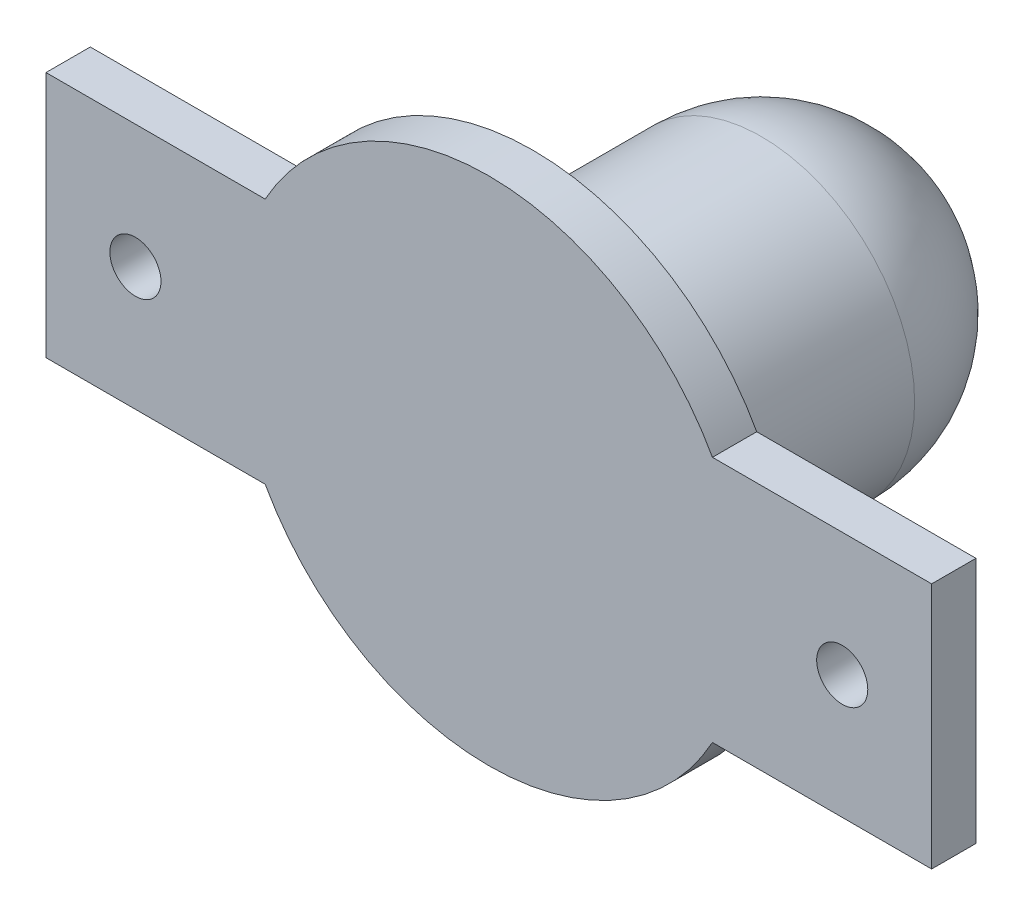
ISO-10303-21;
HEADER;
FILE_DESCRIPTION(('STEP AP214'),'2;1');
FILE_NAME('part.step','',(''),(''),'','','');
FILE_SCHEMA(('AUTOMOTIVE_DESIGN { 1 0 10303 214 1 1 1 1 }'));
ENDSEC;
DATA;
#1=APPLICATION_CONTEXT('core data for automotive mechanical design processes');
#2=APPLICATION_PROTOCOL_DEFINITION('international standard','automotive_design',2000,#1);
#3=PRODUCT_CONTEXT('',#1,'mechanical');
#4=PRODUCT('Part','Part','',(#3));
#5=PRODUCT_RELATED_PRODUCT_CATEGORY('part','',(#4));
#6=PRODUCT_DEFINITION_FORMATION('','',#4);
#7=PRODUCT_DEFINITION_CONTEXT('part definition',#1,'design');
#8=PRODUCT_DEFINITION('design','',#6,#7);
#9=PRODUCT_DEFINITION_SHAPE('','',#8);
#10=(LENGTH_UNIT() NAMED_UNIT(*) SI_UNIT(.MILLI.,.METRE.));
#11=(NAMED_UNIT(*) PLANE_ANGLE_UNIT() SI_UNIT($,.RADIAN.));
#12=(NAMED_UNIT(*) SI_UNIT($,.STERADIAN.) SOLID_ANGLE_UNIT());
#13=UNCERTAINTY_MEASURE_WITH_UNIT(LENGTH_MEASURE(1.E-05),#10,'distance_accuracy_value','');
#14=(GEOMETRIC_REPRESENTATION_CONTEXT(3) GLOBAL_UNCERTAINTY_ASSIGNED_CONTEXT((#13)) GLOBAL_UNIT_ASSIGNED_CONTEXT((#10,
#11,#12)) REPRESENTATION_CONTEXT('',''));
#15=CARTESIAN_POINT('',(0.,0.,0.));
#16=DIRECTION('',(0.,0.,1.));
#17=DIRECTION('',(1.,0.,0.));
#18=AXIS2_PLACEMENT_3D('',#15,#16,#17);
#19=CARTESIAN_POINT('',(26.,-7.25000000000001,-2.6));
#20=DIRECTION('',(0.,-1.,0.));
#21=DIRECTION('',(0.,0.,-1.));
#22=AXIS2_PLACEMENT_3D('',#19,#20,#21);
#23=PLANE('',#22);
#24=DIRECTION('',(1.,0.,0.));
#25=VECTOR('',#24,1.);
#26=CARTESIAN_POINT('',(26.,-7.25000000000001,0.));
#27=LINE('',#26,#25);
#28=CARTESIAN_POINT('',(13.13,-7.25000000000002,0.));
#29=VERTEX_POINT('',#28);
#30=CARTESIAN_POINT('',(26.,-7.25000000000001,0.));
#31=VERTEX_POINT('',#30);
#32=EDGE_CURVE('E133',#29,#31,#27,.T.);
#33=ORIENTED_EDGE('',*,*,#32,.F.);
#34=DIRECTION('',(0.,0.,1.));
#35=VECTOR('',#34,1.);
#36=CARTESIAN_POINT('',(13.13,-7.25000000000002,-2.6));
#37=LINE('',#36,#35);
#38=CARTESIAN_POINT('',(13.13,-7.25000000000002,-2.6));
#39=VERTEX_POINT('',#38);
#40=EDGE_CURVE('E11',#39,#29,#37,.T.);
#41=ORIENTED_EDGE('',*,*,#40,.F.);
#42=DIRECTION('',(1.,0.,0.));
#43=VECTOR('',#42,1.);
#44=CARTESIAN_POINT('',(26.,-7.25000000000001,-2.6));
#45=LINE('',#44,#43);
#46=CARTESIAN_POINT('',(26.,-7.25000000000001,-2.6));
#47=VERTEX_POINT('',#46);
#48=EDGE_CURVE('E154',#39,#47,#45,.T.);
#49=ORIENTED_EDGE('',*,*,#48,.T.);
#50=DIRECTION('',(0.,0.,1.));
#51=VECTOR('',#50,1.);
#52=CARTESIAN_POINT('',(26.,-7.25000000000001,-2.6));
#53=LINE('',#52,#51);
#54=EDGE_CURVE('E39',#47,#31,#53,.T.);
#55=ORIENTED_EDGE('',*,*,#54,.T.);
#56=EDGE_LOOP('',(#33,#41,#49,#55));
#57=FACE_BOUND('',#56,.T.);
#58=ADVANCED_FACE('F36',(#57),#23,.T.);
#59=CARTESIAN_POINT('',(0.,0.,-2.6));
#60=DIRECTION('',(0.,0.,1.));
#61=DIRECTION('',(1.,0.,0.));
#62=AXIS2_PLACEMENT_3D('',#59,#60,#61);
#63=CYLINDRICAL_SURFACE('',#62,14.9986466056108);
#64=CARTESIAN_POINT('',(0.,0.,0.));
#65=DIRECTION('',(0.,0.,1.));
#66=DIRECTION('',(1.,0.,0.));
#67=AXIS2_PLACEMENT_3D('',#64,#65,#66);
#68=CIRCLE('',#67,14.9986466056108);
#69=CARTESIAN_POINT('',(-13.13,-7.25,0.));
#70=VERTEX_POINT('',#69);
#71=EDGE_CURVE('E152',#70,#29,#68,.T.);
#72=ORIENTED_EDGE('',*,*,#71,.F.);
#73=DIRECTION('',(0.,0.,1.));
#74=VECTOR('',#73,1.);
#75=CARTESIAN_POINT('',(-13.13,-7.25,-2.6));
#76=LINE('',#75,#74);
#77=CARTESIAN_POINT('',(-13.13,-7.25,-2.6));
#78=VERTEX_POINT('',#77);
#79=EDGE_CURVE('E45',#78,#70,#76,.T.);
#80=ORIENTED_EDGE('',*,*,#79,.F.);
#81=CARTESIAN_POINT('',(0.,0.,-2.6));
#82=DIRECTION('',(0.,0.,1.));
#83=DIRECTION('',(1.,0.,0.));
#84=AXIS2_PLACEMENT_3D('',#81,#82,#83);
#85=CIRCLE('',#84,14.9986466056108);
#86=EDGE_CURVE('E123',#78,#39,#85,.T.);
#87=ORIENTED_EDGE('',*,*,#86,.T.);
#88=ORIENTED_EDGE('',*,*,#40,.T.);
#89=EDGE_LOOP('',(#72,#80,#87,#88));
#90=FACE_BOUND('',#89,.T.);
#91=ADVANCED_FACE('F166',(#90),#63,.T.);
#92=CARTESIAN_POINT('',(-26.,-7.25,-2.6));
#93=DIRECTION('',(0.,-1.,0.));
#94=DIRECTION('',(0.,0.,-1.));
#95=AXIS2_PLACEMENT_3D('',#92,#93,#94);
#96=PLANE('',#95);
#97=DIRECTION('',(1.,0.,0.));
#98=VECTOR('',#97,1.);
#99=CARTESIAN_POINT('',(-26.,-7.25,0.));
#100=LINE('',#99,#98);
#101=CARTESIAN_POINT('',(-26.,-7.25,0.));
#102=VERTEX_POINT('',#101);
#103=EDGE_CURVE('E110',#102,#70,#100,.T.);
#104=ORIENTED_EDGE('',*,*,#103,.F.);
#105=DIRECTION('',(0.,0.,1.));
#106=VECTOR('',#105,1.);
#107=CARTESIAN_POINT('',(-26.,-7.25,-2.6));
#108=LINE('',#107,#106);
#109=CARTESIAN_POINT('',(-26.,-7.25,-2.6));
#110=VERTEX_POINT('',#109);
#111=EDGE_CURVE('E105',#110,#102,#108,.T.);
#112=ORIENTED_EDGE('',*,*,#111,.F.);
#113=DIRECTION('',(1.,0.,0.));
#114=VECTOR('',#113,1.);
#115=CARTESIAN_POINT('',(-26.,-7.25,-2.6));
#116=LINE('',#115,#114);
#117=EDGE_CURVE('E108',#110,#78,#116,.T.);
#118=ORIENTED_EDGE('',*,*,#117,.T.);
#119=ORIENTED_EDGE('',*,*,#79,.T.);
#120=EDGE_LOOP('',(#104,#112,#118,#119));
#121=FACE_BOUND('',#120,.T.);
#122=ADVANCED_FACE('F107',(#121),#96,.T.);
#123=CARTESIAN_POINT('',(-26.,-7.25,-2.6));
#124=DIRECTION('',(-1.,0.,0.));
#125=DIRECTION('',(0.,0.,1.));
#126=AXIS2_PLACEMENT_3D('',#123,#124,#125);
#127=PLANE('',#126);
#128=DIRECTION('',(0.,-1.,0.));
#129=VECTOR('',#128,1.);
#130=CARTESIAN_POINT('',(-26.,-7.25,0.));
#131=LINE('',#130,#129);
#132=CARTESIAN_POINT('',(-26.,7.25,0.));
#133=VERTEX_POINT('',#132);
#134=EDGE_CURVE('E149',#133,#102,#131,.T.);
#135=ORIENTED_EDGE('',*,*,#134,.F.);
#136=DIRECTION('',(0.,0.,1.));
#137=VECTOR('',#136,1.);
#138=CARTESIAN_POINT('',(-26.,7.25,-2.6));
#139=LINE('',#138,#137);
#140=CARTESIAN_POINT('',(-26.,7.25,-2.6));
#141=VERTEX_POINT('',#140);
#142=EDGE_CURVE('E115',#141,#133,#139,.T.);
#143=ORIENTED_EDGE('',*,*,#142,.F.);
#144=DIRECTION('',(0.,-1.,0.));
#145=VECTOR('',#144,1.);
#146=CARTESIAN_POINT('',(-26.,-7.25,-2.6));
#147=LINE('',#146,#145);
#148=EDGE_CURVE('E121',#141,#110,#147,.T.);
#149=ORIENTED_EDGE('',*,*,#148,.T.);
#150=ORIENTED_EDGE('',*,*,#111,.T.);
#151=EDGE_LOOP('',(#135,#143,#149,#150));
#152=FACE_BOUND('',#151,.T.);
#153=ADVANCED_FACE('F125',(#152),#127,.T.);
#154=CARTESIAN_POINT('',(-26.,7.25,-2.6));
#155=DIRECTION('',(0.,1.,0.));
#156=DIRECTION('',(0.,0.,1.));
#157=AXIS2_PLACEMENT_3D('',#154,#155,#156);
#158=PLANE('',#157);
#159=DIRECTION('',(-1.,0.,0.));
#160=VECTOR('',#159,1.);
#161=CARTESIAN_POINT('',(-26.,7.25,0.));
#162=LINE('',#161,#160);
#163=CARTESIAN_POINT('',(-13.13,7.25,0.));
#164=VERTEX_POINT('',#163);
#165=EDGE_CURVE('E146',#164,#133,#162,.T.);
#166=ORIENTED_EDGE('',*,*,#165,.F.);
#167=DIRECTION('',(0.,0.,1.));
#168=VECTOR('',#167,1.);
#169=CARTESIAN_POINT('',(-13.13,7.25,-2.6));
#170=LINE('',#169,#168);
#171=CARTESIAN_POINT('',(-13.13,7.25,-2.6));
#172=VERTEX_POINT('',#171);
#173=EDGE_CURVE('E158',#172,#164,#170,.T.);
#174=ORIENTED_EDGE('',*,*,#173,.F.);
#175=DIRECTION('',(-1.,0.,0.));
#176=VECTOR('',#175,1.);
#177=CARTESIAN_POINT('',(-26.,7.25,-2.6));
#178=LINE('',#177,#176);
#179=EDGE_CURVE('E126',#172,#141,#178,.T.);
#180=ORIENTED_EDGE('',*,*,#179,.T.);
#181=ORIENTED_EDGE('',*,*,#142,.T.);
#182=EDGE_LOOP('',(#166,#174,#180,#181));
#183=FACE_BOUND('',#182,.T.);
#184=ADVANCED_FACE('F179',(#183),#158,.T.);
#185=CARTESIAN_POINT('',(0.,0.,-2.6));
#186=DIRECTION('',(0.,0.,1.));
#187=DIRECTION('',(1.,0.,0.));
#188=AXIS2_PLACEMENT_3D('',#185,#186,#187);
#189=CYLINDRICAL_SURFACE('',#188,14.9986466056108);
#190=CARTESIAN_POINT('',(0.,0.,0.));
#191=DIRECTION('',(0.,0.,1.));
#192=DIRECTION('',(-1.,0.,0.));
#193=AXIS2_PLACEMENT_3D('',#190,#191,#192);
#194=CIRCLE('',#193,14.9986466056108);
#195=CARTESIAN_POINT('',(13.13,7.25000000000001,0.));
#196=VERTEX_POINT('',#195);
#197=EDGE_CURVE('E143',#196,#164,#194,.T.);
#198=ORIENTED_EDGE('',*,*,#197,.F.);
#199=DIRECTION('',(0.,0.,1.));
#200=VECTOR('',#199,1.);
#201=CARTESIAN_POINT('',(13.13,7.25000000000001,-2.6));
#202=LINE('',#201,#200);
#203=CARTESIAN_POINT('',(13.13,7.25000000000001,-2.6));
#204=VERTEX_POINT('',#203);
#205=EDGE_CURVE('E160',#204,#196,#202,.T.);
#206=ORIENTED_EDGE('',*,*,#205,.F.);
#207=CARTESIAN_POINT('',(0.,0.,-2.6));
#208=DIRECTION('',(0.,0.,1.));
#209=DIRECTION('',(-1.,0.,0.));
#210=AXIS2_PLACEMENT_3D('',#207,#208,#209);
#211=CIRCLE('',#210,14.9986466056108);
#212=EDGE_CURVE('E128',#204,#172,#211,.T.);
#213=ORIENTED_EDGE('',*,*,#212,.T.);
#214=ORIENTED_EDGE('',*,*,#173,.T.);
#215=EDGE_LOOP('',(#198,#206,#213,#214));
#216=FACE_BOUND('',#215,.T.);
#217=ADVANCED_FACE('F182',(#216),#189,.T.);
#218=CARTESIAN_POINT('',(26.,7.25000000000001,-2.6));
#219=DIRECTION('',(0.,1.,0.));
#220=DIRECTION('',(0.,0.,1.));
#221=AXIS2_PLACEMENT_3D('',#218,#219,#220);
#222=PLANE('',#221);
#223=DIRECTION('',(-1.,0.,0.));
#224=VECTOR('',#223,1.);
#225=CARTESIAN_POINT('',(26.,7.25000000000001,0.));
#226=LINE('',#225,#224);
#227=CARTESIAN_POINT('',(26.,7.25000000000001,0.));
#228=VERTEX_POINT('',#227);
#229=EDGE_CURVE('E140',#228,#196,#226,.T.);
#230=ORIENTED_EDGE('',*,*,#229,.F.);
#231=DIRECTION('',(0.,0.,1.));
#232=VECTOR('',#231,1.);
#233=CARTESIAN_POINT('',(26.,7.25000000000001,-2.6));
#234=LINE('',#233,#232);
#235=CARTESIAN_POINT('',(26.,7.25000000000001,-2.6));
#236=VERTEX_POINT('',#235);
#237=EDGE_CURVE('E161',#236,#228,#234,.T.);
#238=ORIENTED_EDGE('',*,*,#237,.F.);
#239=DIRECTION('',(-1.,0.,0.));
#240=VECTOR('',#239,1.);
#241=CARTESIAN_POINT('',(26.,7.25000000000001,-2.6));
#242=LINE('',#241,#240);
#243=EDGE_CURVE('E239',#236,#204,#242,.T.);
#244=ORIENTED_EDGE('',*,*,#243,.T.);
#245=ORIENTED_EDGE('',*,*,#205,.T.);
#246=EDGE_LOOP('',(#230,#238,#244,#245));
#247=FACE_BOUND('',#246,.T.);
#248=ADVANCED_FACE('F186',(#247),#222,.T.);
#249=CARTESIAN_POINT('',(26.,-7.25000000000001,-2.6));
#250=DIRECTION('',(1.,0.,0.));
#251=DIRECTION('',(0.,0.,-1.));
#252=AXIS2_PLACEMENT_3D('',#249,#250,#251);
#253=PLANE('',#252);
#254=DIRECTION('',(0.,1.,0.));
#255=VECTOR('',#254,1.);
#256=CARTESIAN_POINT('',(26.,-7.25000000000001,0.));
#257=LINE('',#256,#255);
#258=EDGE_CURVE('E136',#31,#228,#257,.T.);
#259=ORIENTED_EDGE('',*,*,#258,.F.);
#260=ORIENTED_EDGE('',*,*,#54,.F.);
#261=DIRECTION('',(0.,1.,0.));
#262=VECTOR('',#261,1.);
#263=CARTESIAN_POINT('',(26.,-7.25000000000001,-2.6));
#264=LINE('',#263,#262);
#265=EDGE_CURVE('E237',#47,#236,#264,.T.);
#266=ORIENTED_EDGE('',*,*,#265,.T.);
#267=ORIENTED_EDGE('',*,*,#237,.T.);
#268=EDGE_LOOP('',(#259,#260,#266,#267));
#269=FACE_BOUND('',#268,.T.);
#270=ADVANCED_FACE('F163',(#269),#253,.T.);
#271=CARTESIAN_POINT('',(0.,0.,-2.6));
#272=DIRECTION('',(0.,0.,1.));
#273=DIRECTION('',(1.,0.,0.));
#274=AXIS2_PLACEMENT_3D('',#271,#272,#273);
#275=PLANE('',#274);
#276=CARTESIAN_POINT('',(-20.75,0.,-2.6));
#277=DIRECTION('',(0.,0.,1.));
#278=DIRECTION('',(1.,0.,0.));
#279=AXIS2_PLACEMENT_3D('',#276,#277,#278);
#280=CIRCLE('',#279,1.5);
#281=CARTESIAN_POINT('',(-19.25,0.,-2.6));
#282=VERTEX_POINT('',#281);
#283=EDGE_CURVE('E224',#282,#282,#280,.T.);
#284=ORIENTED_EDGE('',*,*,#283,.T.);
#285=EDGE_LOOP('',(#284));
#286=FACE_BOUND('',#285,.T.);
#287=CARTESIAN_POINT('',(20.75,0.,-2.6));
#288=DIRECTION('',(0.,0.,1.));
#289=DIRECTION('',(1.,0.,0.));
#290=AXIS2_PLACEMENT_3D('',#287,#288,#289);
#291=CIRCLE('',#290,1.5);
#292=CARTESIAN_POINT('',(22.25,0.,-2.6));
#293=VERTEX_POINT('',#292);
#294=EDGE_CURVE('E226',#293,#293,#291,.T.);
#295=ORIENTED_EDGE('',*,*,#294,.T.);
#296=EDGE_LOOP('',(#295));
#297=FACE_BOUND('',#296,.T.);
#298=CARTESIAN_POINT('',(0.,0.,-2.6));
#299=DIRECTION('',(0.,0.,1.));
#300=DIRECTION('',(1.,0.,0.));
#301=AXIS2_PLACEMENT_3D('',#298,#299,#300);
#302=CIRCLE('',#301,9.);
#303=CARTESIAN_POINT('',(9.,0.,-2.6));
#304=VERTEX_POINT('',#303);
#305=EDGE_CURVE('E137',#304,#304,#302,.T.);
#306=ORIENTED_EDGE('',*,*,#305,.T.);
#307=EDGE_LOOP('',(#306));
#308=FACE_BOUND('',#307,.T.);
#309=ORIENTED_EDGE('',*,*,#48,.F.);
#310=ORIENTED_EDGE('',*,*,#86,.F.);
#311=ORIENTED_EDGE('',*,*,#117,.F.);
#312=ORIENTED_EDGE('',*,*,#148,.F.);
#313=ORIENTED_EDGE('',*,*,#179,.F.);
#314=ORIENTED_EDGE('',*,*,#212,.F.);
#315=ORIENTED_EDGE('',*,*,#243,.F.);
#316=ORIENTED_EDGE('',*,*,#265,.F.);
#317=EDGE_LOOP('',(#309,#310,#311,#312,#313,#314,#315,#316));
#318=FACE_BOUND('',#317,.T.);
#319=ADVANCED_FACE('F119',(#286,#297,#308,#318),#275,.F.);
#320=CARTESIAN_POINT('',(0.,0.,0.));
#321=DIRECTION('',(0.,0.,1.));
#322=DIRECTION('',(1.,0.,0.));
#323=AXIS2_PLACEMENT_3D('',#320,#321,#322);
#324=PLANE('',#323);
#325=CARTESIAN_POINT('',(-20.75,0.,0.));
#326=DIRECTION('',(0.,0.,1.));
#327=DIRECTION('',(1.,0.,0.));
#328=AXIS2_PLACEMENT_3D('',#325,#326,#327);
#329=CIRCLE('',#328,1.5);
#330=CARTESIAN_POINT('',(-19.25,0.,0.));
#331=VERTEX_POINT('',#330);
#332=EDGE_CURVE('E222',#331,#331,#329,.T.);
#333=ORIENTED_EDGE('',*,*,#332,.F.);
#334=EDGE_LOOP('',(#333));
#335=FACE_BOUND('',#334,.T.);
#336=CARTESIAN_POINT('',(20.75,0.,0.));
#337=DIRECTION('',(0.,0.,1.));
#338=DIRECTION('',(1.,0.,0.));
#339=AXIS2_PLACEMENT_3D('',#336,#337,#338);
#340=CIRCLE('',#339,1.5);
#341=CARTESIAN_POINT('',(22.25,0.,0.));
#342=VERTEX_POINT('',#341);
#343=EDGE_CURVE('E249',#342,#342,#340,.T.);
#344=ORIENTED_EDGE('',*,*,#343,.F.);
#345=EDGE_LOOP('',(#344));
#346=FACE_BOUND('',#345,.T.);
#347=ORIENTED_EDGE('',*,*,#32,.T.);
#348=ORIENTED_EDGE('',*,*,#258,.T.);
#349=ORIENTED_EDGE('',*,*,#229,.T.);
#350=ORIENTED_EDGE('',*,*,#197,.T.);
#351=ORIENTED_EDGE('',*,*,#165,.T.);
#352=ORIENTED_EDGE('',*,*,#134,.T.);
#353=ORIENTED_EDGE('',*,*,#103,.T.);
#354=ORIENTED_EDGE('',*,*,#71,.T.);
#355=EDGE_LOOP('',(#347,#348,#349,#350,#351,#352,#353,#354));
#356=FACE_BOUND('',#355,.T.);
#357=ADVANCED_FACE('F165',(#335,#346,#356),#324,.T.);
#358=CARTESIAN_POINT('',(0.,0.,-16.));
#359=DIRECTION('',(0.,0.,1.));
#360=DIRECTION('',(1.,0.,0.));
#361=AXIS2_PLACEMENT_3D('',#358,#359,#360);
#362=CYLINDRICAL_SURFACE('',#361,9.);
#363=CARTESIAN_POINT('',(0.,0.,-16.));
#364=DIRECTION('',(0.,0.,1.));
#365=DIRECTION('',(1.,0.,0.));
#366=AXIS2_PLACEMENT_3D('',#363,#364,#365);
#367=CIRCLE('',#366,9.);
#368=CARTESIAN_POINT('',(9.,0.,-16.));
#369=VERTEX_POINT('',#368);
#370=EDGE_CURVE('E225',#369,#369,#367,.T.);
#371=ORIENTED_EDGE('',*,*,#370,.T.);
#372=EDGE_LOOP('',(#371));
#373=FACE_BOUND('',#372,.T.);
#374=ORIENTED_EDGE('',*,*,#305,.F.);
#375=EDGE_LOOP('',(#374));
#376=FACE_BOUND('',#375,.T.);
#377=ADVANCED_FACE('F198',(#373,#376),#362,.T.);
#378=CARTESIAN_POINT('',(0.,0.,-16.));
#379=DIRECTION('',(1.,0.,0.));
#380=DIRECTION('',(0.,-1.,0.));
#381=AXIS2_PLACEMENT_3D('',#378,#379,#380);
#382=SPHERICAL_SURFACE('',#381,9.);
#383=CARTESIAN_POINT('',(0.,0.,-16.));
#384=DIRECTION('',(0.,0.,1.));
#385=DIRECTION('',(1.,0.,0.));
#386=AXIS2_PLACEMENT_3D('',#383,#384,#385);
#387=SPHERICAL_SURFACE('',#386,9.);
#388=ORIENTED_EDGE('',*,*,#370,.F.);
#389=EDGE_LOOP('',(#388));
#390=FACE_BOUND('',#389,.T.);
#391=ADVANCED_FACE('F205',(#390),#387,.T.);
#392=CARTESIAN_POINT('',(20.75,0.,-16.));
#393=DIRECTION('',(0.,0.,1.));
#394=DIRECTION('',(1.,0.,0.));
#395=AXIS2_PLACEMENT_3D('',#392,#393,#394);
#396=CYLINDRICAL_SURFACE('',#395,1.5);
#397=ORIENTED_EDGE('',*,*,#343,.T.);
#398=EDGE_LOOP('',(#397));
#399=FACE_BOUND('',#398,.T.);
#400=ORIENTED_EDGE('',*,*,#294,.F.);
#401=EDGE_LOOP('',(#400));
#402=FACE_BOUND('',#401,.T.);
#403=ADVANCED_FACE('F209',(#399,#402),#396,.F.);
#404=CARTESIAN_POINT('',(-20.75,0.,-16.));
#405=DIRECTION('',(0.,0.,1.));
#406=DIRECTION('',(1.,0.,0.));
#407=AXIS2_PLACEMENT_3D('',#404,#405,#406);
#408=CYLINDRICAL_SURFACE('',#407,1.5);
#409=ORIENTED_EDGE('',*,*,#332,.T.);
#410=EDGE_LOOP('',(#409));
#411=FACE_BOUND('',#410,.T.);
#412=ORIENTED_EDGE('',*,*,#283,.F.);
#413=EDGE_LOOP('',(#412));
#414=FACE_BOUND('',#413,.T.);
#415=ADVANCED_FACE('F213',(#411,#414),#408,.F.);
#416=CLOSED_SHELL('',(#58,#91,#122,#153,#184,#217,#248,#270,#319,#357,#377,#391,#403,#415));
#417=MANIFOLD_SOLID_BREP('B2',#416);
#418=ADVANCED_BREP_SHAPE_REPRESENTATION('',(#18,#417),#14);
#419=SHAPE_DEFINITION_REPRESENTATION(#9,#418);
ENDSEC;
END-ISO-10303-21;
